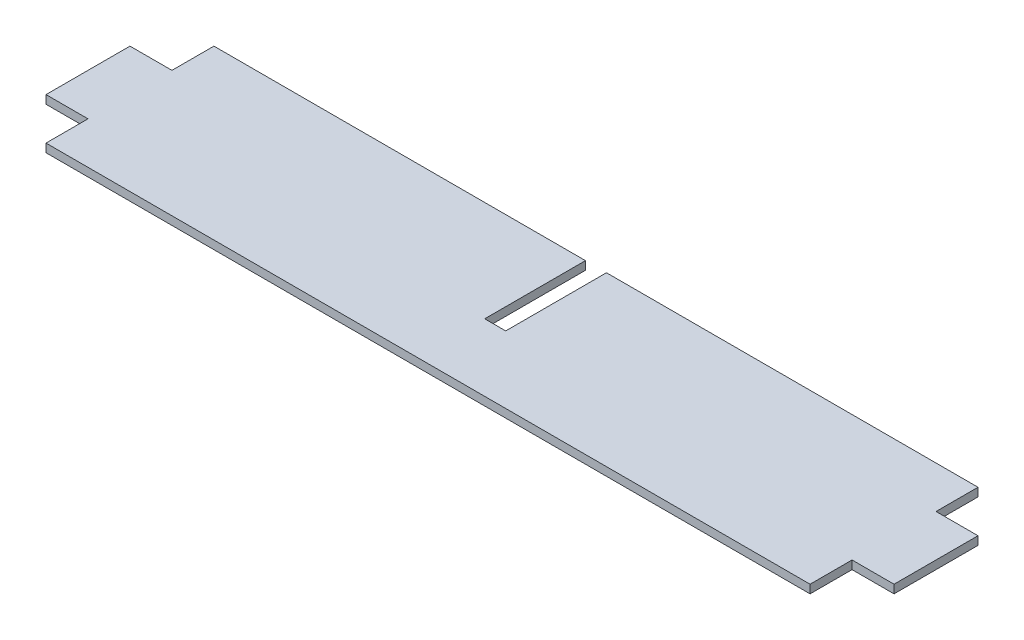
ISO-10303-21;
HEADER;
FILE_DESCRIPTION(('STEP AP214'),'2;1');
FILE_NAME('part.step','',(''),(''),'','','');
FILE_SCHEMA(('AUTOMOTIVE_DESIGN { 1 0 10303 214 1 1 1 1 }'));
ENDSEC;
DATA;
#1=APPLICATION_CONTEXT('core data for automotive mechanical design processes');
#2=APPLICATION_PROTOCOL_DEFINITION('international standard','automotive_design',2000,#1);
#3=PRODUCT_CONTEXT('',#1,'mechanical');
#4=PRODUCT('Part','Part','',(#3));
#5=PRODUCT_RELATED_PRODUCT_CATEGORY('part','',(#4));
#6=PRODUCT_DEFINITION_FORMATION('','',#4);
#7=PRODUCT_DEFINITION_CONTEXT('part definition',#1,'design');
#8=PRODUCT_DEFINITION('design','',#6,#7);
#9=PRODUCT_DEFINITION_SHAPE('','',#8);
#10=(LENGTH_UNIT() NAMED_UNIT(*) SI_UNIT(.MILLI.,.METRE.));
#11=(NAMED_UNIT(*) PLANE_ANGLE_UNIT() SI_UNIT($,.RADIAN.));
#12=(NAMED_UNIT(*) SI_UNIT($,.STERADIAN.) SOLID_ANGLE_UNIT());
#13=UNCERTAINTY_MEASURE_WITH_UNIT(LENGTH_MEASURE(1.E-05),#10,'distance_accuracy_value','');
#14=(GEOMETRIC_REPRESENTATION_CONTEXT(3) GLOBAL_UNCERTAINTY_ASSIGNED_CONTEXT((#13)) GLOBAL_UNIT_ASSIGNED_CONTEXT((#10,
#11,#12)) REPRESENTATION_CONTEXT('',''));
#15=CARTESIAN_POINT('',(0.,0.,0.));
#16=DIRECTION('',(0.,0.,1.));
#17=DIRECTION('',(1.,0.,0.));
#18=AXIS2_PLACEMENT_3D('',#15,#16,#17);
#19=CARTESIAN_POINT('',(0.,10.,0.));
#20=DIRECTION('',(0.,1.,0.));
#21=DIRECTION('',(0.,0.,1.));
#22=AXIS2_PLACEMENT_3D('',#19,#20,#21);
#23=PLANE('',#22);
#24=DIRECTION('',(1.,0.,0.));
#25=VECTOR('',#24,1.);
#26=CARTESIAN_POINT('',(-12.5,10.,19.9999999999999));
#27=LINE('',#26,#25);
#28=CARTESIAN_POINT('',(-12.5,10.,19.9999999999999));
#29=VERTEX_POINT('',#28);
#30=CARTESIAN_POINT('',(12.5,10.,19.9999999999998));
#31=VERTEX_POINT('',#30);
#32=EDGE_CURVE('E159',#29,#31,#27,.T.);
#33=ORIENTED_EDGE('',*,*,#32,.F.);
#34=DIRECTION('',(0.,0.,1.));
#35=VECTOR('',#34,1.);
#36=CARTESIAN_POINT('',(-12.5,10.,-100.));
#37=LINE('',#36,#35);
#38=CARTESIAN_POINT('',(-12.5,10.,-100.));
#39=VERTEX_POINT('',#38);
#40=EDGE_CURVE('E149',#39,#29,#37,.T.);
#41=ORIENTED_EDGE('',*,*,#40,.F.);
#42=DIRECTION('',(-1.,0.,0.));
#43=VECTOR('',#42,1.);
#44=CARTESIAN_POINT('',(505.,10.,-100.));
#45=LINE('',#44,#43);
#46=CARTESIAN_POINT('',(-455.,10.,-100.));
#47=VERTEX_POINT('',#46);
#48=EDGE_CURVE('E42',#39,#47,#45,.T.);
#49=ORIENTED_EDGE('',*,*,#48,.T.);
#50=DIRECTION('',(0.,0.,-1.));
#51=VECTOR('',#50,1.);
#52=CARTESIAN_POINT('',(-455.,10.,-100.));
#53=LINE('',#52,#51);
#54=CARTESIAN_POINT('',(-455.,10.,-50.0000000000001));
#55=VERTEX_POINT('',#54);
#56=EDGE_CURVE('E236',#55,#47,#53,.T.);
#57=ORIENTED_EDGE('',*,*,#56,.F.);
#58=DIRECTION('',(1.,0.,0.));
#59=VECTOR('',#58,1.);
#60=CARTESIAN_POINT('',(-455.,10.,-50.0000000000001));
#61=LINE('',#60,#59);
#62=CARTESIAN_POINT('',(-505.,10.,-50.0000000000001));
#63=VERTEX_POINT('',#62);
#64=EDGE_CURVE('E228',#63,#55,#61,.T.);
#65=ORIENTED_EDGE('',*,*,#64,.F.);
#66=DIRECTION('',(0.,0.,1.));
#67=VECTOR('',#66,1.);
#68=CARTESIAN_POINT('',(-505.,10.,-99.9999999999999));
#69=LINE('',#68,#67);
#70=CARTESIAN_POINT('',(-505.,10.,50.0000000000001));
#71=VERTEX_POINT('',#70);
#72=EDGE_CURVE('E251',#63,#71,#69,.T.);
#73=ORIENTED_EDGE('',*,*,#72,.T.);
#74=DIRECTION('',(1.,0.,0.));
#75=VECTOR('',#74,1.);
#76=CARTESIAN_POINT('',(-455.,10.,50.0000000000001));
#77=LINE('',#76,#75);
#78=CARTESIAN_POINT('',(-455.,10.,50.0000000000001));
#79=VERTEX_POINT('',#78);
#80=EDGE_CURVE('E217',#71,#79,#77,.T.);
#81=ORIENTED_EDGE('',*,*,#80,.T.);
#82=DIRECTION('',(0.,0.,1.));
#83=VECTOR('',#82,1.);
#84=CARTESIAN_POINT('',(-455.,10.,100.));
#85=LINE('',#84,#83);
#86=CARTESIAN_POINT('',(-455.,10.,100.));
#87=VERTEX_POINT('',#86);
#88=EDGE_CURVE('E210',#79,#87,#85,.T.);
#89=ORIENTED_EDGE('',*,*,#88,.T.);
#90=DIRECTION('',(1.,0.,0.));
#91=VECTOR('',#90,1.);
#92=CARTESIAN_POINT('',(-505.,10.,100.));
#93=LINE('',#92,#91);
#94=CARTESIAN_POINT('',(455.,10.,99.9999999999999));
#95=VERTEX_POINT('',#94);
#96=EDGE_CURVE('E254',#87,#95,#93,.T.);
#97=ORIENTED_EDGE('',*,*,#96,.T.);
#98=DIRECTION('',(0.,0.,1.));
#99=VECTOR('',#98,1.);
#100=CARTESIAN_POINT('',(455.,10.,100.));
#101=LINE('',#100,#99);
#102=CARTESIAN_POINT('',(455.,10.,50.0000000000001));
#103=VERTEX_POINT('',#102);
#104=EDGE_CURVE('E58',#103,#95,#101,.T.);
#105=ORIENTED_EDGE('',*,*,#104,.F.);
#106=DIRECTION('',(-1.,0.,0.));
#107=VECTOR('',#106,1.);
#108=CARTESIAN_POINT('',(455.,10.,50.0000000000001));
#109=LINE('',#108,#107);
#110=CARTESIAN_POINT('',(505.,10.,50.0000000000001));
#111=VERTEX_POINT('',#110);
#112=EDGE_CURVE('E166',#111,#103,#109,.T.);
#113=ORIENTED_EDGE('',*,*,#112,.F.);
#114=DIRECTION('',(0.,0.,-1.));
#115=VECTOR('',#114,1.);
#116=CARTESIAN_POINT('',(505.,10.,-100.));
#117=LINE('',#116,#115);
#118=CARTESIAN_POINT('',(505.,10.,-50.0000000000001));
#119=VERTEX_POINT('',#118);
#120=EDGE_CURVE('E257',#111,#119,#117,.T.);
#121=ORIENTED_EDGE('',*,*,#120,.T.);
#122=DIRECTION('',(-1.,0.,0.));
#123=VECTOR('',#122,1.);
#124=CARTESIAN_POINT('',(455.,10.,-50.0000000000001));
#125=LINE('',#124,#123);
#126=CARTESIAN_POINT('',(455.,10.,-50.0000000000001));
#127=VERTEX_POINT('',#126);
#128=EDGE_CURVE('E200',#119,#127,#125,.T.);
#129=ORIENTED_EDGE('',*,*,#128,.T.);
#130=DIRECTION('',(0.,0.,-1.));
#131=VECTOR('',#130,1.);
#132=CARTESIAN_POINT('',(455.,10.,-100.));
#133=LINE('',#132,#131);
#134=CARTESIAN_POINT('',(455.,10.,-100.));
#135=VERTEX_POINT('',#134);
#136=EDGE_CURVE('E193',#127,#135,#133,.T.);
#137=ORIENTED_EDGE('',*,*,#136,.T.);
#138=CARTESIAN_POINT('',(12.5000000000001,10.,-100.));
#139=VERTEX_POINT('',#138);
#140=EDGE_CURVE('E11',#135,#139,#45,.T.);
#141=ORIENTED_EDGE('',*,*,#140,.T.);
#142=DIRECTION('',(0.,0.,-1.));
#143=VECTOR('',#142,1.);
#144=CARTESIAN_POINT('',(12.5,10.,-100.));
#145=LINE('',#144,#143);
#146=EDGE_CURVE('E50',#31,#139,#145,.T.);
#147=ORIENTED_EDGE('',*,*,#146,.F.);
#148=EDGE_LOOP('',(#33,#41,#49,#57,#65,#73,#81,#89,#97,#105,#113,#121,#129,#137,#141,#147));
#149=FACE_BOUND('',#148,.T.);
#150=ADVANCED_FACE('F33',(#149),#23,.T.);
#151=CARTESIAN_POINT('',(0.,0.,0.));
#152=DIRECTION('',(0.,1.,0.));
#153=DIRECTION('',(0.,0.,1.));
#154=AXIS2_PLACEMENT_3D('',#151,#152,#153);
#155=PLANE('',#154);
#156=DIRECTION('',(0.,0.,1.));
#157=VECTOR('',#156,1.);
#158=CARTESIAN_POINT('',(-12.5,0.,-100.));
#159=LINE('',#158,#157);
#160=CARTESIAN_POINT('',(-12.5,0.,-100.));
#161=VERTEX_POINT('',#160);
#162=CARTESIAN_POINT('',(-12.5,0.,19.9999999999999));
#163=VERTEX_POINT('',#162);
#164=EDGE_CURVE('E172',#161,#163,#159,.T.);
#165=ORIENTED_EDGE('',*,*,#164,.T.);
#166=DIRECTION('',(1.,0.,0.));
#167=VECTOR('',#166,1.);
#168=CARTESIAN_POINT('',(-12.5,0.,19.9999999999999));
#169=LINE('',#168,#167);
#170=CARTESIAN_POINT('',(12.5,0.,19.9999999999998));
#171=VERTEX_POINT('',#170);
#172=EDGE_CURVE('E165',#163,#171,#169,.T.);
#173=ORIENTED_EDGE('',*,*,#172,.T.);
#174=DIRECTION('',(0.,0.,-1.));
#175=VECTOR('',#174,1.);
#176=CARTESIAN_POINT('',(12.5,0.,-100.));
#177=LINE('',#176,#175);
#178=CARTESIAN_POINT('',(12.5,0.,-100.));
#179=VERTEX_POINT('',#178);
#180=EDGE_CURVE('E160',#171,#179,#177,.T.);
#181=ORIENTED_EDGE('',*,*,#180,.T.);
#182=DIRECTION('',(-1.,0.,0.));
#183=VECTOR('',#182,1.);
#184=CARTESIAN_POINT('',(505.,0.,-100.));
#185=LINE('',#184,#183);
#186=CARTESIAN_POINT('',(455.,0.,-100.));
#187=VERTEX_POINT('',#186);
#188=EDGE_CURVE('E37',#187,#179,#185,.T.);
#189=ORIENTED_EDGE('',*,*,#188,.F.);
#190=DIRECTION('',(0.,0.,-1.));
#191=VECTOR('',#190,1.);
#192=CARTESIAN_POINT('',(455.,0.,-100.));
#193=LINE('',#192,#191);
#194=CARTESIAN_POINT('',(455.,0.,-50.0000000000001));
#195=VERTEX_POINT('',#194);
#196=EDGE_CURVE('E197',#195,#187,#193,.T.);
#197=ORIENTED_EDGE('',*,*,#196,.F.);
#198=DIRECTION('',(-1.,0.,0.));
#199=VECTOR('',#198,1.);
#200=CARTESIAN_POINT('',(455.,0.,-50.0000000000001));
#201=LINE('',#200,#199);
#202=CARTESIAN_POINT('',(505.,0.,-50.0000000000001));
#203=VERTEX_POINT('',#202);
#204=EDGE_CURVE('E199',#203,#195,#201,.T.);
#205=ORIENTED_EDGE('',*,*,#204,.F.);
#206=DIRECTION('',(0.,0.,-1.));
#207=VECTOR('',#206,1.);
#208=CARTESIAN_POINT('',(505.,0.,-100.));
#209=LINE('',#208,#207);
#210=CARTESIAN_POINT('',(505.,0.,50.0000000000001));
#211=VERTEX_POINT('',#210);
#212=EDGE_CURVE('E263',#211,#203,#209,.T.);
#213=ORIENTED_EDGE('',*,*,#212,.F.);
#214=DIRECTION('',(-1.,0.,0.));
#215=VECTOR('',#214,1.);
#216=CARTESIAN_POINT('',(455.,0.,50.0000000000001));
#217=LINE('',#216,#215);
#218=CARTESIAN_POINT('',(455.,0.,50.0000000000001));
#219=VERTEX_POINT('',#218);
#220=EDGE_CURVE('E181',#211,#219,#217,.T.);
#221=ORIENTED_EDGE('',*,*,#220,.T.);
#222=DIRECTION('',(0.,0.,1.));
#223=VECTOR('',#222,1.);
#224=CARTESIAN_POINT('',(455.,0.,100.));
#225=LINE('',#224,#223);
#226=CARTESIAN_POINT('',(455.,0.,100.));
#227=VERTEX_POINT('',#226);
#228=EDGE_CURVE('E184',#219,#227,#225,.T.);
#229=ORIENTED_EDGE('',*,*,#228,.T.);
#230=DIRECTION('',(1.,0.,0.));
#231=VECTOR('',#230,1.);
#232=CARTESIAN_POINT('',(-505.,0.,100.));
#233=LINE('',#232,#231);
#234=CARTESIAN_POINT('',(-455.,0.,100.));
#235=VERTEX_POINT('',#234);
#236=EDGE_CURVE('E261',#235,#227,#233,.T.);
#237=ORIENTED_EDGE('',*,*,#236,.F.);
#238=DIRECTION('',(0.,0.,1.));
#239=VECTOR('',#238,1.);
#240=CARTESIAN_POINT('',(-455.,0.,100.));
#241=LINE('',#240,#239);
#242=CARTESIAN_POINT('',(-455.,0.,50.0000000000001));
#243=VERTEX_POINT('',#242);
#244=EDGE_CURVE('E214',#243,#235,#241,.T.);
#245=ORIENTED_EDGE('',*,*,#244,.F.);
#246=DIRECTION('',(1.,0.,0.));
#247=VECTOR('',#246,1.);
#248=CARTESIAN_POINT('',(-455.,0.,50.0000000000001));
#249=LINE('',#248,#247);
#250=CARTESIAN_POINT('',(-505.,0.,50.0000000000001));
#251=VERTEX_POINT('',#250);
#252=EDGE_CURVE('E216',#251,#243,#249,.T.);
#253=ORIENTED_EDGE('',*,*,#252,.F.);
#254=DIRECTION('',(0.,0.,1.));
#255=VECTOR('',#254,1.);
#256=CARTESIAN_POINT('',(-505.,0.,-99.9999999999999));
#257=LINE('',#256,#255);
#258=CARTESIAN_POINT('',(-505.,0.,-50.0000000000001));
#259=VERTEX_POINT('',#258);
#260=EDGE_CURVE('E247',#259,#251,#257,.T.);
#261=ORIENTED_EDGE('',*,*,#260,.F.);
#262=DIRECTION('',(1.,0.,0.));
#263=VECTOR('',#262,1.);
#264=CARTESIAN_POINT('',(-455.,0.,-50.0000000000001));
#265=LINE('',#264,#263);
#266=CARTESIAN_POINT('',(-455.,0.,-50.0000000000001));
#267=VERTEX_POINT('',#266);
#268=EDGE_CURVE('E232',#259,#267,#265,.T.);
#269=ORIENTED_EDGE('',*,*,#268,.T.);
#270=DIRECTION('',(0.,0.,-1.));
#271=VECTOR('',#270,1.);
#272=CARTESIAN_POINT('',(-455.,0.,-100.));
#273=LINE('',#272,#271);
#274=CARTESIAN_POINT('',(-455.,0.,-100.));
#275=VERTEX_POINT('',#274);
#276=EDGE_CURVE('E235',#267,#275,#273,.T.);
#277=ORIENTED_EDGE('',*,*,#276,.T.);
#278=EDGE_CURVE('E264',#161,#275,#185,.T.);
#279=ORIENTED_EDGE('',*,*,#278,.F.);
#280=EDGE_LOOP('',(#165,#173,#181,#189,#197,#205,#213,#221,#229,#237,#245,#253,#261,#269,#277,#279));
#281=FACE_BOUND('',#280,.T.);
#282=ADVANCED_FACE('F280',(#281),#155,.F.);
#283=CARTESIAN_POINT('',(505.,10.,-100.));
#284=DIRECTION('',(0.,0.,1.));
#285=DIRECTION('',(1.,0.,0.));
#286=AXIS2_PLACEMENT_3D('',#283,#284,#285);
#287=PLANE('',#286);
#288=DIRECTION('',(0.,-1.,0.));
#289=VECTOR('',#288,1.);
#290=CARTESIAN_POINT('',(-12.5,10.,-100.));
#291=LINE('',#290,#289);
#292=EDGE_CURVE('E155',#39,#161,#291,.T.);
#293=ORIENTED_EDGE('',*,*,#292,.T.);
#294=ORIENTED_EDGE('',*,*,#278,.T.);
#295=DIRECTION('',(0.,1.,0.));
#296=VECTOR('',#295,1.);
#297=CARTESIAN_POINT('',(-455.,0.,-100.));
#298=LINE('',#297,#296);
#299=EDGE_CURVE('E244',#275,#47,#298,.T.);
#300=ORIENTED_EDGE('',*,*,#299,.T.);
#301=ORIENTED_EDGE('',*,*,#48,.F.);
#302=EDGE_LOOP('',(#293,#294,#300,#301));
#303=FACE_BOUND('',#302,.T.);
#304=ADVANCED_FACE('F296',(#303),#287,.F.);
#305=DIRECTION('',(0.,-1.,0.));
#306=VECTOR('',#305,1.);
#307=CARTESIAN_POINT('',(12.5,10.,-100.));
#308=LINE('',#307,#306);
#309=EDGE_CURVE('E178',#139,#179,#308,.T.);
#310=ORIENTED_EDGE('',*,*,#309,.F.);
#311=ORIENTED_EDGE('',*,*,#140,.F.);
#312=DIRECTION('',(0.,1.,0.));
#313=VECTOR('',#312,1.);
#314=CARTESIAN_POINT('',(455.,0.,-100.));
#315=LINE('',#314,#313);
#316=EDGE_CURVE('E202',#187,#135,#315,.T.);
#317=ORIENTED_EDGE('',*,*,#316,.F.);
#318=ORIENTED_EDGE('',*,*,#188,.T.);
#319=EDGE_LOOP('',(#310,#311,#317,#318));
#320=FACE_BOUND('',#319,.T.);
#321=ADVANCED_FACE('F276',(#320),#287,.F.);
#322=CARTESIAN_POINT('',(505.,10.,-100.));
#323=DIRECTION('',(-1.,0.,0.));
#324=DIRECTION('',(0.,0.,1.));
#325=AXIS2_PLACEMENT_3D('',#322,#323,#324);
#326=PLANE('',#325);
#327=ORIENTED_EDGE('',*,*,#120,.F.);
#328=DIRECTION('',(0.,1.,0.));
#329=VECTOR('',#328,1.);
#330=CARTESIAN_POINT('',(505.,0.,50.0000000000001));
#331=LINE('',#330,#329);
#332=EDGE_CURVE('E187',#211,#111,#331,.T.);
#333=ORIENTED_EDGE('',*,*,#332,.F.);
#334=ORIENTED_EDGE('',*,*,#212,.T.);
#335=DIRECTION('',(0.,1.,0.));
#336=VECTOR('',#335,1.);
#337=CARTESIAN_POINT('',(505.,0.,-50.0000000000001));
#338=LINE('',#337,#336);
#339=EDGE_CURVE('E207',#203,#119,#338,.T.);
#340=ORIENTED_EDGE('',*,*,#339,.T.);
#341=EDGE_LOOP('',(#327,#333,#334,#340));
#342=FACE_BOUND('',#341,.T.);
#343=ADVANCED_FACE('F304',(#342),#326,.F.);
#344=CARTESIAN_POINT('',(-505.,10.,-99.9999999999999));
#345=DIRECTION('',(1.,0.,0.));
#346=DIRECTION('',(0.,0.,-1.));
#347=AXIS2_PLACEMENT_3D('',#344,#345,#346);
#348=PLANE('',#347);
#349=DIRECTION('',(0.,1.,0.));
#350=VECTOR('',#349,1.);
#351=CARTESIAN_POINT('',(-505.,0.,50.0000000000001));
#352=LINE('',#351,#350);
#353=EDGE_CURVE('E225',#251,#71,#352,.T.);
#354=ORIENTED_EDGE('',*,*,#353,.T.);
#355=ORIENTED_EDGE('',*,*,#72,.F.);
#356=DIRECTION('',(0.,1.,0.));
#357=VECTOR('',#356,1.);
#358=CARTESIAN_POINT('',(-505.,0.,-50.0000000000001));
#359=LINE('',#358,#357);
#360=EDGE_CURVE('E239',#259,#63,#359,.T.);
#361=ORIENTED_EDGE('',*,*,#360,.F.);
#362=ORIENTED_EDGE('',*,*,#260,.T.);
#363=EDGE_LOOP('',(#354,#355,#361,#362));
#364=FACE_BOUND('',#363,.T.);
#365=ADVANCED_FACE('F35',(#364),#348,.F.);
#366=CARTESIAN_POINT('',(-505.,10.,100.));
#367=DIRECTION('',(0.,0.,-1.));
#368=DIRECTION('',(-1.,0.,0.));
#369=AXIS2_PLACEMENT_3D('',#366,#367,#368);
#370=PLANE('',#369);
#371=ORIENTED_EDGE('',*,*,#236,.T.);
#372=DIRECTION('',(0.,1.,0.));
#373=VECTOR('',#372,1.);
#374=CARTESIAN_POINT('',(455.,0.,100.));
#375=LINE('',#374,#373);
#376=EDGE_CURVE('E191',#227,#95,#375,.T.);
#377=ORIENTED_EDGE('',*,*,#376,.T.);
#378=ORIENTED_EDGE('',*,*,#96,.F.);
#379=DIRECTION('',(0.,1.,0.));
#380=VECTOR('',#379,1.);
#381=CARTESIAN_POINT('',(-455.,0.,100.));
#382=LINE('',#381,#380);
#383=EDGE_CURVE('E220',#235,#87,#382,.T.);
#384=ORIENTED_EDGE('',*,*,#383,.F.);
#385=EDGE_LOOP('',(#371,#377,#378,#384));
#386=FACE_BOUND('',#385,.T.);
#387=ADVANCED_FACE('F306',(#386),#370,.F.);
#388=CARTESIAN_POINT('',(-455.,0.,-100.));
#389=DIRECTION('',(1.,0.,0.));
#390=DIRECTION('',(0.,0.,-1.));
#391=AXIS2_PLACEMENT_3D('',#388,#389,#390);
#392=PLANE('',#391);
#393=ORIENTED_EDGE('',*,*,#56,.T.);
#394=ORIENTED_EDGE('',*,*,#299,.F.);
#395=ORIENTED_EDGE('',*,*,#276,.F.);
#396=DIRECTION('',(0.,1.,0.));
#397=VECTOR('',#396,1.);
#398=CARTESIAN_POINT('',(-455.,0.,-50.0000000000001));
#399=LINE('',#398,#397);
#400=EDGE_CURVE('E248',#267,#55,#399,.T.);
#401=ORIENTED_EDGE('',*,*,#400,.T.);
#402=EDGE_LOOP('',(#393,#394,#395,#401));
#403=FACE_BOUND('',#402,.T.);
#404=ADVANCED_FACE('F308',(#403),#392,.F.);
#405=CARTESIAN_POINT('',(-455.,0.,-50.0000000000001));
#406=DIRECTION('',(0.,0.,1.));
#407=DIRECTION('',(1.,0.,0.));
#408=AXIS2_PLACEMENT_3D('',#405,#406,#407);
#409=PLANE('',#408);
#410=ORIENTED_EDGE('',*,*,#64,.T.);
#411=ORIENTED_EDGE('',*,*,#400,.F.);
#412=ORIENTED_EDGE('',*,*,#268,.F.);
#413=ORIENTED_EDGE('',*,*,#360,.T.);
#414=EDGE_LOOP('',(#410,#411,#412,#413));
#415=FACE_BOUND('',#414,.T.);
#416=ADVANCED_FACE('F299',(#415),#409,.F.);
#417=CARTESIAN_POINT('',(-455.,0.,50.0000000000001));
#418=DIRECTION('',(0.,0.,1.));
#419=DIRECTION('',(1.,0.,0.));
#420=AXIS2_PLACEMENT_3D('',#417,#418,#419);
#421=PLANE('',#420);
#422=ORIENTED_EDGE('',*,*,#80,.F.);
#423=ORIENTED_EDGE('',*,*,#353,.F.);
#424=ORIENTED_EDGE('',*,*,#252,.T.);
#425=DIRECTION('',(0.,1.,0.));
#426=VECTOR('',#425,1.);
#427=CARTESIAN_POINT('',(-455.,0.,50.0000000000001));
#428=LINE('',#427,#426);
#429=EDGE_CURVE('E229',#243,#79,#428,.T.);
#430=ORIENTED_EDGE('',*,*,#429,.T.);
#431=EDGE_LOOP('',(#422,#423,#424,#430));
#432=FACE_BOUND('',#431,.T.);
#433=ADVANCED_FACE('F331',(#432),#421,.T.);
#434=CARTESIAN_POINT('',(-455.,0.,100.));
#435=DIRECTION('',(-1.,0.,0.));
#436=DIRECTION('',(0.,0.,1.));
#437=AXIS2_PLACEMENT_3D('',#434,#435,#436);
#438=PLANE('',#437);
#439=ORIENTED_EDGE('',*,*,#88,.F.);
#440=ORIENTED_EDGE('',*,*,#429,.F.);
#441=ORIENTED_EDGE('',*,*,#244,.T.);
#442=ORIENTED_EDGE('',*,*,#383,.T.);
#443=EDGE_LOOP('',(#439,#440,#441,#442));
#444=FACE_BOUND('',#443,.T.);
#445=ADVANCED_FACE('F329',(#444),#438,.T.);
#446=CARTESIAN_POINT('',(455.,0.,-50.0000000000001));
#447=DIRECTION('',(0.,0.,-1.));
#448=DIRECTION('',(-1.,0.,0.));
#449=AXIS2_PLACEMENT_3D('',#446,#447,#448);
#450=PLANE('',#449);
#451=ORIENTED_EDGE('',*,*,#128,.F.);
#452=ORIENTED_EDGE('',*,*,#339,.F.);
#453=ORIENTED_EDGE('',*,*,#204,.T.);
#454=DIRECTION('',(0.,1.,0.));
#455=VECTOR('',#454,1.);
#456=CARTESIAN_POINT('',(455.,0.,-50.0000000000001));
#457=LINE('',#456,#455);
#458=EDGE_CURVE('E211',#195,#127,#457,.T.);
#459=ORIENTED_EDGE('',*,*,#458,.T.);
#460=EDGE_LOOP('',(#451,#452,#453,#459));
#461=FACE_BOUND('',#460,.T.);
#462=ADVANCED_FACE('F347',(#461),#450,.T.);
#463=CARTESIAN_POINT('',(455.,0.,-100.));
#464=DIRECTION('',(1.,0.,0.));
#465=DIRECTION('',(0.,0.,-1.));
#466=AXIS2_PLACEMENT_3D('',#463,#464,#465);
#467=PLANE('',#466);
#468=ORIENTED_EDGE('',*,*,#136,.F.);
#469=ORIENTED_EDGE('',*,*,#458,.F.);
#470=ORIENTED_EDGE('',*,*,#196,.T.);
#471=ORIENTED_EDGE('',*,*,#316,.T.);
#472=EDGE_LOOP('',(#468,#469,#470,#471));
#473=FACE_BOUND('',#472,.T.);
#474=ADVANCED_FACE('F350',(#473),#467,.T.);
#475=CARTESIAN_POINT('',(455.,0.,100.));
#476=DIRECTION('',(-1.,0.,0.));
#477=DIRECTION('',(0.,0.,1.));
#478=AXIS2_PLACEMENT_3D('',#475,#476,#477);
#479=PLANE('',#478);
#480=ORIENTED_EDGE('',*,*,#104,.T.);
#481=ORIENTED_EDGE('',*,*,#376,.F.);
#482=ORIENTED_EDGE('',*,*,#228,.F.);
#483=DIRECTION('',(0.,1.,0.));
#484=VECTOR('',#483,1.);
#485=CARTESIAN_POINT('',(455.,0.,50.0000000000001));
#486=LINE('',#485,#484);
#487=EDGE_CURVE('E194',#219,#103,#486,.T.);
#488=ORIENTED_EDGE('',*,*,#487,.T.);
#489=EDGE_LOOP('',(#480,#481,#482,#488));
#490=FACE_BOUND('',#489,.T.);
#491=ADVANCED_FACE('F322',(#490),#479,.F.);
#492=CARTESIAN_POINT('',(455.,0.,50.0000000000001));
#493=DIRECTION('',(0.,0.,-1.));
#494=DIRECTION('',(-1.,0.,0.));
#495=AXIS2_PLACEMENT_3D('',#492,#493,#494);
#496=PLANE('',#495);
#497=ORIENTED_EDGE('',*,*,#112,.T.);
#498=ORIENTED_EDGE('',*,*,#487,.F.);
#499=ORIENTED_EDGE('',*,*,#220,.F.);
#500=ORIENTED_EDGE('',*,*,#332,.T.);
#501=EDGE_LOOP('',(#497,#498,#499,#500));
#502=FACE_BOUND('',#501,.T.);
#503=ADVANCED_FACE('F325',(#502),#496,.F.);
#504=CARTESIAN_POINT('',(-12.5,10.,-100.));
#505=DIRECTION('',(1.,0.,0.));
#506=DIRECTION('',(0.,0.,-1.));
#507=AXIS2_PLACEMENT_3D('',#504,#505,#506);
#508=PLANE('',#507);
#509=ORIENTED_EDGE('',*,*,#164,.F.);
#510=ORIENTED_EDGE('',*,*,#292,.F.);
#511=ORIENTED_EDGE('',*,*,#40,.T.);
#512=DIRECTION('',(0.,-1.,0.));
#513=VECTOR('',#512,1.);
#514=CARTESIAN_POINT('',(-12.5,10.,19.9999999999999));
#515=LINE('',#514,#513);
#516=EDGE_CURVE('E152',#29,#163,#515,.T.);
#517=ORIENTED_EDGE('',*,*,#516,.T.);
#518=EDGE_LOOP('',(#509,#510,#511,#517));
#519=FACE_BOUND('',#518,.T.);
#520=ADVANCED_FACE('F151',(#519),#508,.T.);
#521=CARTESIAN_POINT('',(-12.5,10.,19.9999999999999));
#522=DIRECTION('',(0.,0.,-1.));
#523=DIRECTION('',(-1.,0.,0.));
#524=AXIS2_PLACEMENT_3D('',#521,#522,#523);
#525=PLANE('',#524);
#526=ORIENTED_EDGE('',*,*,#172,.F.);
#527=ORIENTED_EDGE('',*,*,#516,.F.);
#528=ORIENTED_EDGE('',*,*,#32,.T.);
#529=DIRECTION('',(0.,-1.,0.));
#530=VECTOR('',#529,1.);
#531=CARTESIAN_POINT('',(12.5,10.,19.9999999999998));
#532=LINE('',#531,#530);
#533=EDGE_CURVE('E167',#31,#171,#532,.T.);
#534=ORIENTED_EDGE('',*,*,#533,.T.);
#535=EDGE_LOOP('',(#526,#527,#528,#534));
#536=FACE_BOUND('',#535,.T.);
#537=ADVANCED_FACE('F163',(#536),#525,.T.);
#538=CARTESIAN_POINT('',(12.5,10.,-100.));
#539=DIRECTION('',(-1.,0.,0.));
#540=DIRECTION('',(0.,0.,1.));
#541=AXIS2_PLACEMENT_3D('',#538,#539,#540);
#542=PLANE('',#541);
#543=ORIENTED_EDGE('',*,*,#180,.F.);
#544=ORIENTED_EDGE('',*,*,#533,.F.);
#545=ORIENTED_EDGE('',*,*,#146,.T.);
#546=ORIENTED_EDGE('',*,*,#309,.T.);
#547=EDGE_LOOP('',(#543,#544,#545,#546));
#548=FACE_BOUND('',#547,.T.);
#549=ADVANCED_FACE('F283',(#548),#542,.T.);
#550=CLOSED_SHELL('',(#150,#282,#304,#321,#343,#365,#387,#404,#416,#433,#445,#462,#474,#491,
#503,#520,#537,#549));
#551=MANIFOLD_SOLID_BREP('B2',#550);
#552=ADVANCED_BREP_SHAPE_REPRESENTATION('',(#18,#551),#14);
#553=SHAPE_DEFINITION_REPRESENTATION(#9,#552);
ENDSEC;
END-ISO-10303-21;
